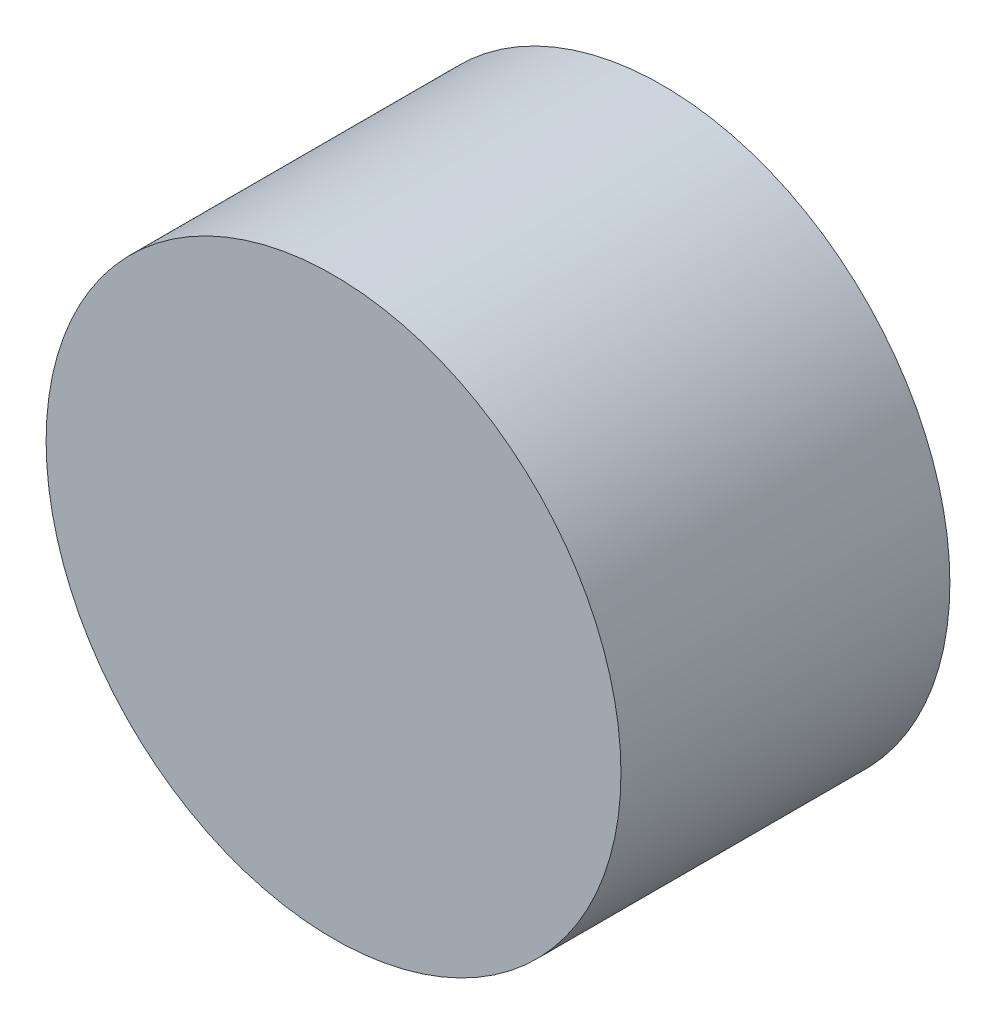
ISO-10303-21;
HEADER;
FILE_DESCRIPTION(('STEP AP214'),'2;1');
FILE_NAME('part.step','',(''),(''),'','','');
FILE_SCHEMA(('AUTOMOTIVE_DESIGN { 1 0 10303 214 1 1 1 1 }'));
ENDSEC;
DATA;
#1=APPLICATION_CONTEXT('core data for automotive mechanical design processes');
#2=APPLICATION_PROTOCOL_DEFINITION('international standard','automotive_design',2000,#1);
#3=PRODUCT_CONTEXT('',#1,'mechanical');
#4=PRODUCT('Part','Part','',(#3));
#5=PRODUCT_RELATED_PRODUCT_CATEGORY('part','',(#4));
#6=PRODUCT_DEFINITION_FORMATION('','',#4);
#7=PRODUCT_DEFINITION_CONTEXT('part definition',#1,'design');
#8=PRODUCT_DEFINITION('design','',#6,#7);
#9=PRODUCT_DEFINITION_SHAPE('','',#8);
#10=(LENGTH_UNIT() NAMED_UNIT(*) SI_UNIT(.MILLI.,.METRE.));
#11=(NAMED_UNIT(*) PLANE_ANGLE_UNIT() SI_UNIT($,.RADIAN.));
#12=(NAMED_UNIT(*) SI_UNIT($,.STERADIAN.) SOLID_ANGLE_UNIT());
#13=UNCERTAINTY_MEASURE_WITH_UNIT(LENGTH_MEASURE(1.E-05),#10,'distance_accuracy_value','');
#14=(GEOMETRIC_REPRESENTATION_CONTEXT(3) GLOBAL_UNCERTAINTY_ASSIGNED_CONTEXT((#13)) GLOBAL_UNIT_ASSIGNED_CONTEXT((#10,
#11,#12)) REPRESENTATION_CONTEXT('',''));
#15=CARTESIAN_POINT('',(0.,0.,0.));
#16=DIRECTION('',(0.,0.,1.));
#17=DIRECTION('',(1.,0.,0.));
#18=AXIS2_PLACEMENT_3D('',#15,#16,#17);
#19=CARTESIAN_POINT('',(0.,0.,30.5));
#20=DIRECTION('',(0.,0.,-1.));
#21=DIRECTION('',(-1.,0.,0.));
#22=AXIS2_PLACEMENT_3D('',#19,#20,#21);
#23=CYLINDRICAL_SURFACE('',#22,26.65);
#24=CARTESIAN_POINT('',(0.,0.,30.5));
#25=DIRECTION('',(0.,0.,1.));
#26=DIRECTION('',(1.,0.,0.));
#27=AXIS2_PLACEMENT_3D('',#24,#25,#26);
#28=CIRCLE('',#27,26.65);
#29=CARTESIAN_POINT('',(-26.65,0.,30.5));
#30=VERTEX_POINT('',#29);
#31=EDGE_CURVE('E10',#30,#30,#28,.T.);
#32=CARTESIAN_POINT('',(0.,0.,0.));
#33=DIRECTION('',(0.,0.,1.));
#34=DIRECTION('',(1.,0.,0.));
#35=AXIS2_PLACEMENT_3D('',#32,#33,#34);
#36=CIRCLE('',#35,26.65);
#37=CARTESIAN_POINT('',(-26.65,0.,0.));
#38=VERTEX_POINT('',#37);
#39=EDGE_CURVE('E34',#38,#38,#36,.T.);
#40=CARTESIAN_POINT('',(-26.65,0.,30.5));
#41=CARTESIAN_POINT('',(-26.65,0.,30.1822916666667));
#42=CARTESIAN_POINT('',(-26.65,0.,29.8645833333333));
#43=CARTESIAN_POINT('',(-26.65,0.,29.2291666666667));
#44=CARTESIAN_POINT('',(-26.65,0.,28.9114583333333));
#45=CARTESIAN_POINT('',(-26.65,0.,28.2760416666667));
#46=CARTESIAN_POINT('',(-26.65,0.,27.9583333333333));
#47=CARTESIAN_POINT('',(-26.65,0.,27.3229166666667));
#48=CARTESIAN_POINT('',(-26.65,0.,27.0052083333333));
#49=CARTESIAN_POINT('',(-26.65,0.,26.3697916666667));
#50=CARTESIAN_POINT('',(-26.65,0.,26.0520833333333));
#51=CARTESIAN_POINT('',(-26.65,0.,25.4166666666667));
#52=CARTESIAN_POINT('',(-26.65,0.,25.0989583333333));
#53=CARTESIAN_POINT('',(-26.65,0.,24.4635416666667));
#54=CARTESIAN_POINT('',(-26.65,0.,24.1458333333333));
#55=CARTESIAN_POINT('',(-26.65,0.,23.5104166666667));
#56=CARTESIAN_POINT('',(-26.65,0.,23.1927083333333));
#57=CARTESIAN_POINT('',(-26.65,0.,22.5572916666667));
#58=CARTESIAN_POINT('',(-26.65,0.,22.2395833333333));
#59=CARTESIAN_POINT('',(-26.65,0.,21.6041666666667));
#60=CARTESIAN_POINT('',(-26.65,0.,21.2864583333333));
#61=CARTESIAN_POINT('',(-26.65,0.,20.6510416666667));
#62=CARTESIAN_POINT('',(-26.65,0.,20.3333333333333));
#63=CARTESIAN_POINT('',(-26.65,0.,19.6979166666667));
#64=CARTESIAN_POINT('',(-26.65,0.,19.3802083333333));
#65=CARTESIAN_POINT('',(-26.65,0.,18.7447916666667));
#66=CARTESIAN_POINT('',(-26.65,0.,18.4270833333333));
#67=CARTESIAN_POINT('',(-26.65,0.,17.7916666666667));
#68=CARTESIAN_POINT('',(-26.65,0.,17.4739583333333));
#69=CARTESIAN_POINT('',(-26.65,0.,16.8385416666667));
#70=CARTESIAN_POINT('',(-26.65,0.,16.5208333333333));
#71=CARTESIAN_POINT('',(-26.65,0.,15.8854166666667));
#72=CARTESIAN_POINT('',(-26.65,0.,15.5677083333333));
#73=CARTESIAN_POINT('',(-26.65,0.,14.9322916666667));
#74=CARTESIAN_POINT('',(-26.65,0.,14.6145833333333));
#75=CARTESIAN_POINT('',(-26.65,0.,13.9791666666667));
#76=CARTESIAN_POINT('',(-26.65,0.,13.6614583333333));
#77=CARTESIAN_POINT('',(-26.65,0.,13.0260416666667));
#78=CARTESIAN_POINT('',(-26.65,0.,12.7083333333333));
#79=CARTESIAN_POINT('',(-26.65,0.,12.0729166666667));
#80=CARTESIAN_POINT('',(-26.65,0.,11.7552083333333));
#81=CARTESIAN_POINT('',(-26.65,0.,11.1197916666667));
#82=CARTESIAN_POINT('',(-26.65,0.,10.8020833333333));
#83=CARTESIAN_POINT('',(-26.65,0.,10.1666666666667));
#84=CARTESIAN_POINT('',(-26.65,0.,9.84895833333333));
#85=CARTESIAN_POINT('',(-26.65,0.,9.21354166666666));
#86=CARTESIAN_POINT('',(-26.65,0.,8.89583333333333));
#87=CARTESIAN_POINT('',(-26.65,0.,8.26041666666666));
#88=CARTESIAN_POINT('',(-26.65,0.,7.94270833333333));
#89=CARTESIAN_POINT('',(-26.65,0.,7.30729166666666));
#90=CARTESIAN_POINT('',(-26.65,0.,6.98958333333333));
#91=CARTESIAN_POINT('',(-26.65,0.,6.35416666666666));
#92=CARTESIAN_POINT('',(-26.65,0.,6.03645833333333));
#93=CARTESIAN_POINT('',(-26.65,0.,5.40104166666666));
#94=CARTESIAN_POINT('',(-26.65,0.,5.08333333333333));
#95=CARTESIAN_POINT('',(-26.65,0.,4.44791666666666));
#96=CARTESIAN_POINT('',(-26.65,0.,4.13020833333333));
#97=CARTESIAN_POINT('',(-26.65,0.,3.49479166666666));
#98=CARTESIAN_POINT('',(-26.65,0.,3.17708333333333));
#99=CARTESIAN_POINT('',(-26.65,0.,2.54166666666666));
#100=CARTESIAN_POINT('',(-26.65,0.,2.22395833333333));
#101=CARTESIAN_POINT('',(-26.65,0.,1.58854166666666));
#102=CARTESIAN_POINT('',(-26.65,0.,1.27083333333333));
#103=CARTESIAN_POINT('',(-26.65,0.,0.635416666666662));
#104=CARTESIAN_POINT('',(-26.65,0.,0.317708333333329));
#105=CARTESIAN_POINT('',(-26.65,0.,0.));
#106=B_SPLINE_CURVE_WITH_KNOTS('',3,(#40,#41,#42,#43,#44,#45,#46,#47,#48,#49,#50,#51,#52,#53,
#54,#55,#56,#57,#58,#59,#60,#61,#62,#63,#64,#65,#66,#67,#68,#69,#70,#71,#72,#73,#74,#75,#76,#77,
#78,#79,#80,#81,#82,#83,#84,#85,#86,#87,#88,#89,#90,#91,#92,#93,#94,#95,#96,#97,#98,#99,#100,
#101,#102,#103,#104,#105),.UNSPECIFIED.,.F.,.F.,(4,2,2,2,2,2,2,2,2,2,2,2,2,2,2,2,2,2,2,2,2,2,2,
2,2,2,2,2,2,2,2,2,4),(0.,0.953124999999999,1.90625,2.859375,3.8125,4.765625,5.71875,6.671875,
7.625,8.57812499999999,9.53125,10.484375,11.4375,12.390625,13.34375,14.296875,15.25,16.203125,
17.15625,18.109375,19.0625,20.015625,20.96875,21.921875,22.875,23.828125,24.78125,25.734375,
26.6875,27.640625,28.59375,29.546875,30.5),.UNSPECIFIED.);
#107=EDGE_CURVE('BSEAM31',#30,#38,#106,.T.);
#108=ORIENTED_EDGE('',*,*,#31,.F.);
#109=ORIENTED_EDGE('',*,*,#39,.T.);
#110=ORIENTED_EDGE('',*,*,#107,.T.);
#111=ORIENTED_EDGE('',*,*,#107,.F.);
#112=EDGE_LOOP('',(#108,#110,#109,#111));
#113=FACE_BOUND('',#112,.T.);
#114=ADVANCED_FACE('F31',(#113),#23,.T.);
#115=CARTESIAN_POINT('',(0.,0.,30.5));
#116=DIRECTION('',(0.,0.,1.));
#117=DIRECTION('',(1.,0.,0.));
#118=AXIS2_PLACEMENT_3D('',#115,#116,#117);
#119=PLANE('',#118);
#120=ORIENTED_EDGE('',*,*,#31,.T.);
#121=EDGE_LOOP('',(#120));
#122=FACE_BOUND('',#121,.T.);
#123=ADVANCED_FACE('F46',(#122),#119,.T.);
#124=CARTESIAN_POINT('',(0.,0.,0.));
#125=DIRECTION('',(0.,0.,1.));
#126=DIRECTION('',(1.,0.,0.));
#127=AXIS2_PLACEMENT_3D('',#124,#125,#126);
#128=PLANE('',#127);
#129=ORIENTED_EDGE('',*,*,#39,.F.);
#130=EDGE_LOOP('',(#129));
#131=FACE_BOUND('',#130,.T.);
#132=ADVANCED_FACE('F44',(#131),#128,.F.);
#133=CLOSED_SHELL('',(#114,#123,#132));
#134=MANIFOLD_SOLID_BREP('B2',#133);
#135=ADVANCED_BREP_SHAPE_REPRESENTATION('',(#18,#134),#14);
#136=SHAPE_DEFINITION_REPRESENTATION(#9,#135);
ENDSEC;
END-ISO-10303-21;
